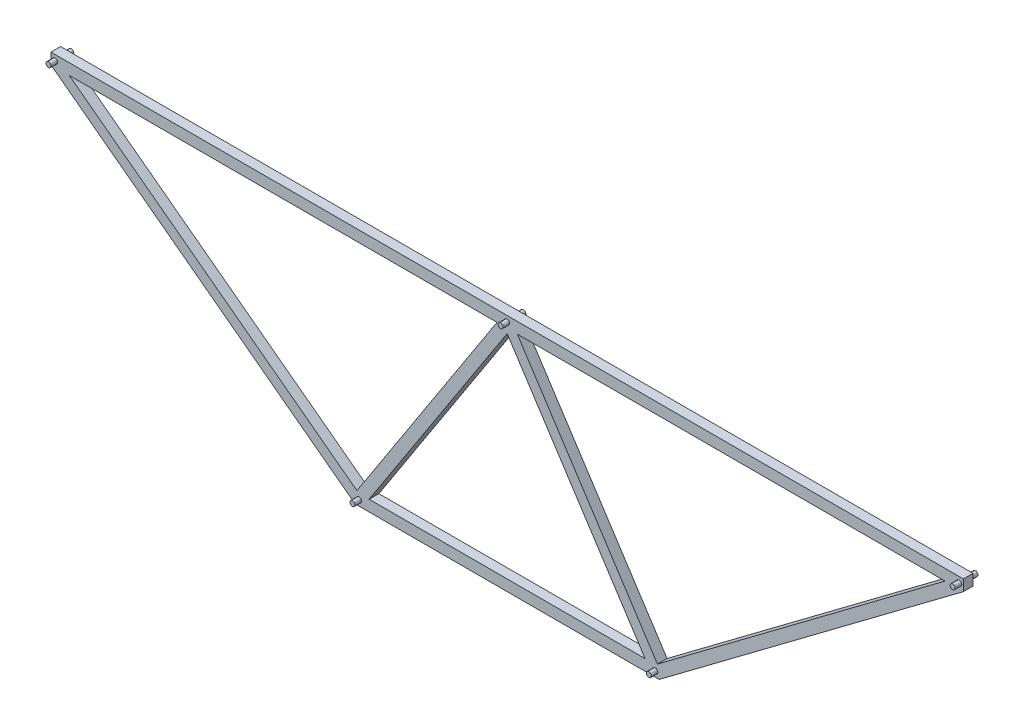
ISO-10303-21;
HEADER;
FILE_DESCRIPTION(('STEP AP214'),'2;1');
FILE_NAME('part.step','',(''),(''),'','','');
FILE_SCHEMA(('AUTOMOTIVE_DESIGN { 1 0 10303 214 1 1 1 1 }'));
ENDSEC;
DATA;
#1=APPLICATION_CONTEXT('core data for automotive mechanical design processes');
#2=APPLICATION_PROTOCOL_DEFINITION('international standard','automotive_design',2000,#1);
#3=PRODUCT_CONTEXT('',#1,'mechanical');
#4=PRODUCT('Part','Part','',(#3));
#5=PRODUCT_RELATED_PRODUCT_CATEGORY('part','',(#4));
#6=PRODUCT_DEFINITION_FORMATION('','',#4);
#7=PRODUCT_DEFINITION_CONTEXT('part definition',#1,'design');
#8=PRODUCT_DEFINITION('design','',#6,#7);
#9=PRODUCT_DEFINITION_SHAPE('','',#8);
#10=(LENGTH_UNIT() NAMED_UNIT(*) SI_UNIT(.MILLI.,.METRE.));
#11=(NAMED_UNIT(*) PLANE_ANGLE_UNIT() SI_UNIT($,.RADIAN.));
#12=(NAMED_UNIT(*) SI_UNIT($,.STERADIAN.) SOLID_ANGLE_UNIT());
#13=UNCERTAINTY_MEASURE_WITH_UNIT(LENGTH_MEASURE(1.E-05),#10,'distance_accuracy_value','');
#14=(GEOMETRIC_REPRESENTATION_CONTEXT(3) GLOBAL_UNCERTAINTY_ASSIGNED_CONTEXT((#13)) GLOBAL_UNIT_ASSIGNED_CONTEXT((#10,
#11,#12)) REPRESENTATION_CONTEXT('',''));
#15=CARTESIAN_POINT('',(0.,0.,0.));
#16=DIRECTION('',(0.,0.,1.));
#17=DIRECTION('',(1.,0.,0.));
#18=AXIS2_PLACEMENT_3D('',#15,#16,#17);
#19=CARTESIAN_POINT('',(0.,-14.4899999999999,6.375));
#20=DIRECTION('',(0.,-1.,0.));
#21=DIRECTION('',(1.,0.,0.));
#22=AXIS2_PLACEMENT_3D('',#19,#20,#21);
#23=PLANE('',#22);
#24=DIRECTION('',(-1.,0.,0.));
#25=VECTOR('',#24,1.);
#26=CARTESIAN_POINT('',(0.,-14.4899999999999,-6.375));
#27=LINE('',#26,#25);
#28=CARTESIAN_POINT('',(-13.3443939456725,-14.4899999999999,-6.375));
#29=VERTEX_POINT('',#28);
#30=CARTESIAN_POINT('',(-575.85,-14.4899999999999,-6.375));
#31=VERTEX_POINT('',#30);
#32=EDGE_CURVE('E170',#29,#31,#27,.T.);
#33=ORIENTED_EDGE('',*,*,#32,.F.);
#34=DIRECTION('',(0.,0.,-1.));
#35=VECTOR('',#34,1.);
#36=CARTESIAN_POINT('',(-13.3443939456725,-14.4899999999999,6.375));
#37=LINE('',#36,#35);
#38=CARTESIAN_POINT('',(-13.3443939456725,-14.4899999999999,6.375));
#39=VERTEX_POINT('',#38);
#40=EDGE_CURVE('E163',#39,#29,#37,.T.);
#41=ORIENTED_EDGE('',*,*,#40,.F.);
#42=DIRECTION('',(-1.,0.,0.));
#43=VECTOR('',#42,1.);
#44=CARTESIAN_POINT('',(0.,-14.4899999999999,6.375));
#45=LINE('',#44,#43);
#46=CARTESIAN_POINT('',(-575.85,-14.4899999999999,6.375));
#47=VERTEX_POINT('',#46);
#48=EDGE_CURVE('E167',#39,#47,#45,.T.);
#49=ORIENTED_EDGE('',*,*,#48,.T.);
#50=DIRECTION('',(0.,0.,-1.));
#51=VECTOR('',#50,1.);
#52=CARTESIAN_POINT('',(-575.85,-14.4899999999999,6.375));
#53=LINE('',#52,#51);
#54=EDGE_CURVE('E124',#47,#31,#53,.T.);
#55=ORIENTED_EDGE('',*,*,#54,.T.);
#56=EDGE_LOOP('',(#33,#41,#49,#55));
#57=FACE_BOUND('',#56,.T.);
#58=ADVANCED_FACE('F50',(#57),#23,.T.);
#59=CARTESIAN_POINT('',(-2.76651894132001,1.79678724359608,6.375));
#60=DIRECTION('',(0.838644419486702,-0.544679297994528,0.));
#61=DIRECTION('',(0.544679297994528,0.838644419486703,0.));
#62=AXIS2_PLACEMENT_3D('',#59,#60,#61);
#63=PLANE('',#62);
#64=DIRECTION('',(-0.544679297994528,-0.838644419486703,0.));
#65=VECTOR('',#64,1.);
#66=CARTESIAN_POINT('',(-2.76651894132001,1.79678724359608,-6.375));
#67=LINE('',#66,#65);
#68=CARTESIAN_POINT('',(-197.595006689379,-298.181244982965,-6.375));
#69=VERTEX_POINT('',#68);
#70=EDGE_CURVE('E244',#29,#69,#67,.T.);
#71=ORIENTED_EDGE('',*,*,#70,.T.);
#72=DIRECTION('',(0.,0.,-1.));
#73=VECTOR('',#72,1.);
#74=CARTESIAN_POINT('',(-197.595006689379,-298.181244982965,6.375));
#75=LINE('',#74,#73);
#76=CARTESIAN_POINT('',(-197.595006689379,-298.181244982965,6.375));
#77=VERTEX_POINT('',#76);
#78=EDGE_CURVE('E171',#77,#69,#75,.T.);
#79=ORIENTED_EDGE('',*,*,#78,.F.);
#80=DIRECTION('',(-0.544679297994528,-0.838644419486703,0.));
#81=VECTOR('',#80,1.);
#82=CARTESIAN_POINT('',(-2.76651894132001,1.79678724359608,6.375));
#83=LINE('',#82,#81);
#84=EDGE_CURVE('E172',#39,#77,#83,.T.);
#85=ORIENTED_EDGE('',*,*,#84,.F.);
#86=ORIENTED_EDGE('',*,*,#40,.T.);
#87=EDGE_LOOP('',(#71,#79,#85,#86));
#88=FACE_BOUND('',#87,.T.);
#89=ADVANCED_FACE('F177',(#88),#63,.F.);
#90=CARTESIAN_POINT('',(-9.38543869704231,-6.09561578434463,6.375));
#91=DIRECTION('',(0.838644419486703,0.544679297994528,0.));
#92=DIRECTION('',(-0.544679297994528,0.838644419486703,0.));
#93=AXIS2_PLACEMENT_3D('',#90,#91,#92);
#94=PLANE('',#93);
#95=DIRECTION('',(0.544679297994528,-0.838644419486703,0.));
#96=VECTOR('',#95,1.);
#97=CARTESIAN_POINT('',(-9.38543869704231,-6.09561578434463,-6.375));
#98=LINE('',#97,#96);
#99=CARTESIAN_POINT('',(0.,-20.546405114304,-6.375));
#100=VERTEX_POINT('',#99);
#101=CARTESIAN_POINT('',(181.498361340734,-300.,-6.375));
#102=VERTEX_POINT('',#101);
#103=EDGE_CURVE('E226',#100,#102,#98,.T.);
#104=ORIENTED_EDGE('',*,*,#103,.T.);
#105=DIRECTION('',(0.,0.,-1.));
#106=VECTOR('',#105,1.);
#107=CARTESIAN_POINT('',(181.498361340734,-300.,6.375));
#108=LINE('',#107,#106);
#109=CARTESIAN_POINT('',(181.498361340734,-300.,6.375));
#110=VERTEX_POINT('',#109);
#111=EDGE_CURVE('E246',#110,#102,#108,.T.);
#112=ORIENTED_EDGE('',*,*,#111,.F.);
#113=DIRECTION('',(0.544679297994528,-0.838644419486703,0.));
#114=VECTOR('',#113,1.);
#115=CARTESIAN_POINT('',(-9.38543869704231,-6.09561578434463,6.375));
#116=LINE('',#115,#114);
#117=CARTESIAN_POINT('',(0.,-20.546405114304,6.375));
#118=VERTEX_POINT('',#117);
#119=EDGE_CURVE('E331',#118,#110,#116,.T.);
#120=ORIENTED_EDGE('',*,*,#119,.F.);
#121=DIRECTION('',(0.,0.,-1.));
#122=VECTOR('',#121,1.);
#123=CARTESIAN_POINT('',(0.,-20.546405114304,6.375));
#124=LINE('',#123,#122);
#125=EDGE_CURVE('E252',#118,#100,#124,.T.);
#126=ORIENTED_EDGE('',*,*,#125,.T.);
#127=EDGE_LOOP('',(#104,#112,#120,#126));
#128=FACE_BOUND('',#127,.T.);
#129=ADVANCED_FACE('F334',(#128),#94,.F.);
#130=CARTESIAN_POINT('',(0.,-300.,6.375));
#131=DIRECTION('',(0.,1.,0.));
#132=DIRECTION('',(-1.,0.,0.));
#133=AXIS2_PLACEMENT_3D('',#130,#131,#132);
#134=PLANE('',#133);
#135=DIRECTION('',(1.,0.,0.));
#136=VECTOR('',#135,1.);
#137=CARTESIAN_POINT('',(0.,-300.,-6.375));
#138=LINE('',#137,#136);
#139=CARTESIAN_POINT('',(-181.498361340734,-300.,-6.375));
#140=VERTEX_POINT('',#139);
#141=EDGE_CURVE('E232',#140,#102,#138,.T.);
#142=ORIENTED_EDGE('',*,*,#141,.F.);
#143=DIRECTION('',(0.,0.,-1.));
#144=VECTOR('',#143,1.);
#145=CARTESIAN_POINT('',(-181.498361340734,-300.,6.375));
#146=LINE('',#145,#144);
#147=CARTESIAN_POINT('',(-181.498361340734,-300.,6.375));
#148=VERTEX_POINT('',#147);
#149=EDGE_CURVE('E254',#148,#140,#146,.T.);
#150=ORIENTED_EDGE('',*,*,#149,.F.);
#151=DIRECTION('',(1.,0.,0.));
#152=VECTOR('',#151,1.);
#153=CARTESIAN_POINT('',(0.,-300.,6.375));
#154=LINE('',#153,#152);
#155=EDGE_CURVE('E183',#148,#110,#154,.T.);
#156=ORIENTED_EDGE('',*,*,#155,.T.);
#157=ORIENTED_EDGE('',*,*,#111,.T.);
#158=EDGE_LOOP('',(#142,#150,#156,#157));
#159=FACE_BOUND('',#158,.T.);
#160=ADVANCED_FACE('F335',(#159),#134,.T.);
#161=CARTESIAN_POINT('',(222.9552,-297.2736,6.375));
#162=DIRECTION('',(-0.6,0.8,0.));
#163=DIRECTION('',(-0.8,-0.6,0.));
#164=AXIS2_PLACEMENT_3D('',#161,#162,#163);
#165=PLANE('',#164);
#166=DIRECTION('',(0.8,0.6,0.));
#167=VECTOR('',#166,1.);
#168=CARTESIAN_POINT('',(222.9552,-297.2736,-6.375));
#169=LINE('',#168,#167);
#170=CARTESIAN_POINT('',(200.,-314.49,-6.375));
#171=VERTEX_POINT('',#170);
#172=CARTESIAN_POINT('',(600.,-14.49,-6.375));
#173=VERTEX_POINT('',#172);
#174=EDGE_CURVE('E202',#171,#173,#169,.T.);
#175=ORIENTED_EDGE('',*,*,#174,.T.);
#176=DIRECTION('',(0.,0.,-1.));
#177=VECTOR('',#176,1.);
#178=CARTESIAN_POINT('',(600.,-14.49,6.375));
#179=LINE('',#178,#177);
#180=CARTESIAN_POINT('',(600.,-14.49,6.375));
#181=VERTEX_POINT('',#180);
#182=EDGE_CURVE('E258',#181,#173,#179,.T.);
#183=ORIENTED_EDGE('',*,*,#182,.F.);
#184=DIRECTION('',(0.8,0.6,0.));
#185=VECTOR('',#184,1.);
#186=CARTESIAN_POINT('',(222.9552,-297.2736,6.375));
#187=LINE('',#186,#185);
#188=CARTESIAN_POINT('',(200.,-314.49,6.375));
#189=VERTEX_POINT('',#188);
#190=EDGE_CURVE('E359',#189,#181,#187,.T.);
#191=ORIENTED_EDGE('',*,*,#190,.F.);
#192=DIRECTION('',(0.,0.,-1.));
#193=VECTOR('',#192,1.);
#194=CARTESIAN_POINT('',(200.,-314.49,6.375));
#195=LINE('',#194,#193);
#196=EDGE_CURVE('E261',#189,#171,#195,.T.);
#197=ORIENTED_EDGE('',*,*,#196,.T.);
#198=EDGE_LOOP('',(#175,#183,#191,#197));
#199=FACE_BOUND('',#198,.T.);
#200=ADVANCED_FACE('F469',(#199),#165,.F.);
#201=CARTESIAN_POINT('',(600.,0.,6.375));
#202=DIRECTION('',(1.,0.,0.));
#203=DIRECTION('',(0.,0.,-1.));
#204=AXIS2_PLACEMENT_3D('',#201,#202,#203);
#205=PLANE('',#204);
#206=DIRECTION('',(0.,-1.,0.));
#207=VECTOR('',#206,1.);
#208=CARTESIAN_POINT('',(600.,0.,-6.375));
#209=LINE('',#208,#207);
#210=CARTESIAN_POINT('',(600.,3.66859327116945E-13,-6.375));
#211=VERTEX_POINT('',#210);
#212=EDGE_CURVE('E207',#211,#173,#209,.T.);
#213=ORIENTED_EDGE('',*,*,#212,.F.);
#214=DIRECTION('',(0.,0.,-1.));
#215=VECTOR('',#214,1.);
#216=CARTESIAN_POINT('',(600.,3.66859327116945E-13,6.375));
#217=LINE('',#216,#215);
#218=CARTESIAN_POINT('',(600.,3.66859327116945E-13,6.375));
#219=VERTEX_POINT('',#218);
#220=EDGE_CURVE('E274',#219,#211,#217,.T.);
#221=ORIENTED_EDGE('',*,*,#220,.F.);
#222=DIRECTION('',(0.,-1.,0.));
#223=VECTOR('',#222,1.);
#224=CARTESIAN_POINT('',(600.,0.,6.375));
#225=LINE('',#224,#223);
#226=EDGE_CURVE('E355',#219,#181,#225,.T.);
#227=ORIENTED_EDGE('',*,*,#226,.T.);
#228=ORIENTED_EDGE('',*,*,#182,.T.);
#229=EDGE_LOOP('',(#213,#221,#227,#228));
#230=FACE_BOUND('',#229,.T.);
#231=ADVANCED_FACE('F484',(#230),#205,.T.);
#232=CARTESIAN_POINT('',(0.,3.66859327116945E-13,6.375));
#233=DIRECTION('',(0.,-1.,0.));
#234=DIRECTION('',(0.,0.,-1.));
#235=AXIS2_PLACEMENT_3D('',#232,#233,#234);
#236=PLANE('',#235);
#237=DIRECTION('',(-1.,0.,0.));
#238=VECTOR('',#237,1.);
#239=CARTESIAN_POINT('',(0.,3.66859327116945E-13,-6.375));
#240=LINE('',#239,#238);
#241=CARTESIAN_POINT('',(-600.,3.66859327116945E-13,-6.375));
#242=VERTEX_POINT('',#241);
#243=EDGE_CURVE('E213',#211,#242,#240,.T.);
#244=ORIENTED_EDGE('',*,*,#243,.T.);
#245=DIRECTION('',(0.,0.,-1.));
#246=VECTOR('',#245,1.);
#247=CARTESIAN_POINT('',(-600.,3.66859327116945E-13,6.375));
#248=LINE('',#247,#246);
#249=CARTESIAN_POINT('',(-600.,3.66859327116945E-13,6.375));
#250=VERTEX_POINT('',#249);
#251=EDGE_CURVE('E271',#250,#242,#248,.T.);
#252=ORIENTED_EDGE('',*,*,#251,.F.);
#253=DIRECTION('',(-1.,0.,0.));
#254=VECTOR('',#253,1.);
#255=CARTESIAN_POINT('',(0.,3.66859327116945E-13,6.375));
#256=LINE('',#255,#254);
#257=EDGE_CURVE('E348',#219,#250,#256,.T.);
#258=ORIENTED_EDGE('',*,*,#257,.F.);
#259=ORIENTED_EDGE('',*,*,#220,.T.);
#260=EDGE_LOOP('',(#244,#252,#258,#259));
#261=FACE_BOUND('',#260,.T.);
#262=ADVANCED_FACE('F481',(#261),#236,.F.);
#263=CARTESIAN_POINT('',(-600.,0.,6.375));
#264=DIRECTION('',(1.,0.,0.));
#265=DIRECTION('',(0.,0.,-1.));
#266=AXIS2_PLACEMENT_3D('',#263,#264,#265);
#267=PLANE('',#266);
#268=DIRECTION('',(0.,-1.,0.));
#269=VECTOR('',#268,1.);
#270=CARTESIAN_POINT('',(-600.,0.,-6.375));
#271=LINE('',#270,#269);
#272=CARTESIAN_POINT('',(-600.,-14.4899999999999,-6.375));
#273=VERTEX_POINT('',#272);
#274=EDGE_CURVE('E216',#242,#273,#271,.T.);
#275=ORIENTED_EDGE('',*,*,#274,.T.);
#276=DIRECTION('',(0.,0.,-1.));
#277=VECTOR('',#276,1.);
#278=CARTESIAN_POINT('',(-600.,-14.4899999999999,6.375));
#279=LINE('',#278,#277);
#280=CARTESIAN_POINT('',(-600.,-14.4899999999999,6.375));
#281=VERTEX_POINT('',#280);
#282=EDGE_CURVE('E268',#281,#273,#279,.T.);
#283=ORIENTED_EDGE('',*,*,#282,.F.);
#284=DIRECTION('',(0.,-1.,0.));
#285=VECTOR('',#284,1.);
#286=CARTESIAN_POINT('',(-600.,0.,6.375));
#287=LINE('',#286,#285);
#288=EDGE_CURVE('E350',#250,#281,#287,.T.);
#289=ORIENTED_EDGE('',*,*,#288,.F.);
#290=ORIENTED_EDGE('',*,*,#251,.T.);
#291=EDGE_LOOP('',(#275,#283,#289,#290));
#292=FACE_BOUND('',#291,.T.);
#293=ADVANCED_FACE('F480',(#292),#267,.F.);
#294=CARTESIAN_POINT('',(-222.9552,-297.2736,6.375));
#295=DIRECTION('',(-0.6,-0.8,0.));
#296=DIRECTION('',(0.8,-0.6,0.));
#297=AXIS2_PLACEMENT_3D('',#294,#295,#296);
#298=PLANE('',#297);
#299=DIRECTION('',(-0.8,0.6,0.));
#300=VECTOR('',#299,1.);
#301=CARTESIAN_POINT('',(-222.9552,-297.2736,-6.375));
#302=LINE('',#301,#300);
#303=CARTESIAN_POINT('',(-200.,-314.49,-6.375));
#304=VERTEX_POINT('',#303);
#305=EDGE_CURVE('E219',#304,#273,#302,.T.);
#306=ORIENTED_EDGE('',*,*,#305,.F.);
#307=DIRECTION('',(0.,0.,-1.));
#308=VECTOR('',#307,1.);
#309=CARTESIAN_POINT('',(-200.,-314.49,6.375));
#310=LINE('',#309,#308);
#311=CARTESIAN_POINT('',(-200.,-314.49,6.375));
#312=VERTEX_POINT('',#311);
#313=EDGE_CURVE('E264',#312,#304,#310,.T.);
#314=ORIENTED_EDGE('',*,*,#313,.F.);
#315=DIRECTION('',(-0.8,0.6,0.));
#316=VECTOR('',#315,1.);
#317=CARTESIAN_POINT('',(-222.9552,-297.2736,6.375));
#318=LINE('',#317,#316);
#319=EDGE_CURVE('E345',#312,#281,#318,.T.);
#320=ORIENTED_EDGE('',*,*,#319,.T.);
#321=ORIENTED_EDGE('',*,*,#282,.T.);
#322=EDGE_LOOP('',(#306,#314,#320,#321));
#323=FACE_BOUND('',#322,.T.);
#324=ADVANCED_FACE('F475',(#323),#298,.T.);
#325=CARTESIAN_POINT('',(0.,-14.4899999999999,6.375));
#326=DIRECTION('',(0.,-1.,0.));
#327=DIRECTION('',(1.,0.,0.));
#328=AXIS2_PLACEMENT_3D('',#325,#326,#327);
#329=PLANE('',#328);
#330=DIRECTION('',(-1.,0.,0.));
#331=VECTOR('',#330,1.);
#332=CARTESIAN_POINT('',(0.,-14.4899999999999,-6.375));
#333=LINE('',#332,#331);
#334=CARTESIAN_POINT('',(575.85,-14.49,-6.375));
#335=VERTEX_POINT('',#334);
#336=CARTESIAN_POINT('',(13.3443939456725,-14.4899999999999,-6.375));
#337=VERTEX_POINT('',#336);
#338=EDGE_CURVE('E194',#335,#337,#333,.T.);
#339=ORIENTED_EDGE('',*,*,#338,.F.);
#340=DIRECTION('',(0.,0.,-1.));
#341=VECTOR('',#340,1.);
#342=CARTESIAN_POINT('',(575.85,-14.49,6.375));
#343=LINE('',#342,#341);
#344=CARTESIAN_POINT('',(575.85,-14.49,6.375));
#345=VERTEX_POINT('',#344);
#346=EDGE_CURVE('E129',#345,#335,#343,.T.);
#347=ORIENTED_EDGE('',*,*,#346,.F.);
#348=DIRECTION('',(-1.,0.,0.));
#349=VECTOR('',#348,1.);
#350=CARTESIAN_POINT('',(0.,-14.4899999999999,6.375));
#351=LINE('',#350,#349);
#352=CARTESIAN_POINT('',(13.3443939456725,-14.4899999999999,6.375));
#353=VERTEX_POINT('',#352);
#354=EDGE_CURVE('E247',#345,#353,#351,.T.);
#355=ORIENTED_EDGE('',*,*,#354,.T.);
#356=DIRECTION('',(0.,0.,-1.));
#357=VECTOR('',#356,1.);
#358=CARTESIAN_POINT('',(13.3443939456725,-14.4899999999999,6.375));
#359=LINE('',#358,#357);
#360=EDGE_CURVE('E192',#353,#337,#359,.T.);
#361=ORIENTED_EDGE('',*,*,#360,.T.);
#362=EDGE_LOOP('',(#339,#347,#355,#361));
#363=FACE_BOUND('',#362,.T.);
#364=ADVANCED_FACE('F47',(#363),#329,.T.);
#365=CARTESIAN_POINT('',(214.2612,-285.6816,6.375));
#366=DIRECTION('',(-0.6,0.8,0.));
#367=DIRECTION('',(-0.8,-0.6,0.));
#368=AXIS2_PLACEMENT_3D('',#365,#366,#367);
#369=PLANE('',#368);
#370=DIRECTION('',(0.8,0.6,0.));
#371=VECTOR('',#370,1.);
#372=CARTESIAN_POINT('',(214.2612,-285.6816,-6.375));
#373=LINE('',#372,#371);
#374=CARTESIAN_POINT('',(197.59500668938,-298.181244982965,-6.375));
#375=VERTEX_POINT('',#374);
#376=EDGE_CURVE('E198',#375,#335,#373,.T.);
#377=ORIENTED_EDGE('',*,*,#376,.F.);
#378=DIRECTION('',(0.,0.,-1.));
#379=VECTOR('',#378,1.);
#380=CARTESIAN_POINT('',(197.59500668938,-298.181244982965,6.375));
#381=LINE('',#380,#379);
#382=CARTESIAN_POINT('',(197.59500668938,-298.181244982965,6.375));
#383=VERTEX_POINT('',#382);
#384=EDGE_CURVE('E281',#383,#375,#381,.T.);
#385=ORIENTED_EDGE('',*,*,#384,.F.);
#386=DIRECTION('',(0.8,0.6,0.));
#387=VECTOR('',#386,1.);
#388=CARTESIAN_POINT('',(214.2612,-285.6816,6.375));
#389=LINE('',#388,#387);
#390=EDGE_CURVE('E365',#383,#345,#389,.T.);
#391=ORIENTED_EDGE('',*,*,#390,.T.);
#392=ORIENTED_EDGE('',*,*,#346,.T.);
#393=EDGE_LOOP('',(#377,#385,#391,#392));
#394=FACE_BOUND('',#393,.T.);
#395=ADVANCED_FACE('F463',(#394),#369,.T.);
#396=CARTESIAN_POINT('',(9.38543869704231,-6.09561578434462,6.375));
#397=DIRECTION('',(0.838644419486703,-0.544679297994527,0.));
#398=DIRECTION('',(0.544679297994527,0.838644419486703,0.));
#399=AXIS2_PLACEMENT_3D('',#396,#397,#398);
#400=PLANE('',#399);
#401=DIRECTION('',(-0.544679297994527,-0.838644419486703,0.));
#402=VECTOR('',#401,1.);
#403=CARTESIAN_POINT('',(9.38543869704231,-6.09561578434462,-6.375));
#404=LINE('',#403,#402);
#405=EDGE_CURVE('E233',#100,#140,#404,.T.);
#406=ORIENTED_EDGE('',*,*,#405,.F.);
#407=ORIENTED_EDGE('',*,*,#125,.F.);
#408=DIRECTION('',(-0.544679297994527,-0.838644419486703,0.));
#409=VECTOR('',#408,1.);
#410=CARTESIAN_POINT('',(9.38543869704231,-6.09561578434462,6.375));
#411=LINE('',#410,#409);
#412=EDGE_CURVE('E182',#118,#148,#411,.T.);
#413=ORIENTED_EDGE('',*,*,#412,.T.);
#414=ORIENTED_EDGE('',*,*,#149,.T.);
#415=EDGE_LOOP('',(#406,#407,#413,#414));
#416=FACE_BOUND('',#415,.T.);
#417=ADVANCED_FACE('F326',(#416),#400,.T.);
#418=CARTESIAN_POINT('',(0.,-314.49,6.375));
#419=DIRECTION('',(0.,1.,0.));
#420=DIRECTION('',(-1.,0.,0.));
#421=AXIS2_PLACEMENT_3D('',#418,#419,#420);
#422=PLANE('',#421);
#423=DIRECTION('',(1.,0.,0.));
#424=VECTOR('',#423,1.);
#425=CARTESIAN_POINT('',(0.,-314.49,-6.375));
#426=LINE('',#425,#424);
#427=EDGE_CURVE('E221',#304,#171,#426,.T.);
#428=ORIENTED_EDGE('',*,*,#427,.T.);
#429=ORIENTED_EDGE('',*,*,#196,.F.);
#430=DIRECTION('',(1.,0.,0.));
#431=VECTOR('',#430,1.);
#432=CARTESIAN_POINT('',(0.,-314.49,6.375));
#433=LINE('',#432,#431);
#434=EDGE_CURVE('E336',#312,#189,#433,.T.);
#435=ORIENTED_EDGE('',*,*,#434,.F.);
#436=ORIENTED_EDGE('',*,*,#313,.T.);
#437=EDGE_LOOP('',(#428,#429,#435,#436));
#438=FACE_BOUND('',#437,.T.);
#439=ADVANCED_FACE('F465',(#438),#422,.F.);
#440=CARTESIAN_POINT('',(2.76651894132001,1.79678724359608,6.375));
#441=DIRECTION('',(0.838644419486702,0.544679297994528,0.));
#442=DIRECTION('',(-0.544679297994528,0.838644419486702,0.));
#443=AXIS2_PLACEMENT_3D('',#440,#441,#442);
#444=PLANE('',#443);
#445=DIRECTION('',(0.544679297994528,-0.838644419486702,0.));
#446=VECTOR('',#445,1.);
#447=CARTESIAN_POINT('',(2.76651894132001,1.79678724359608,-6.375));
#448=LINE('',#447,#446);
#449=EDGE_CURVE('E203',#337,#375,#448,.T.);
#450=ORIENTED_EDGE('',*,*,#449,.F.);
#451=ORIENTED_EDGE('',*,*,#360,.F.);
#452=DIRECTION('',(0.544679297994528,-0.838644419486702,0.));
#453=VECTOR('',#452,1.);
#454=CARTESIAN_POINT('',(2.76651894132001,1.79678724359608,6.375));
#455=LINE('',#454,#453);
#456=EDGE_CURVE('E358',#353,#383,#455,.T.);
#457=ORIENTED_EDGE('',*,*,#456,.T.);
#458=ORIENTED_EDGE('',*,*,#384,.T.);
#459=EDGE_LOOP('',(#450,#451,#457,#458));
#460=FACE_BOUND('',#459,.T.);
#461=ADVANCED_FACE('F472',(#460),#444,.T.);
#462=CARTESIAN_POINT('',(-214.2612,-285.6816,6.375));
#463=DIRECTION('',(-0.6,-0.8,0.));
#464=DIRECTION('',(0.8,-0.6,0.));
#465=AXIS2_PLACEMENT_3D('',#462,#463,#464);
#466=PLANE('',#465);
#467=DIRECTION('',(-0.8,0.6,0.));
#468=VECTOR('',#467,1.);
#469=CARTESIAN_POINT('',(-214.2612,-285.6816,-6.375));
#470=LINE('',#469,#468);
#471=EDGE_CURVE('E113',#69,#31,#470,.T.);
#472=ORIENTED_EDGE('',*,*,#471,.T.);
#473=ORIENTED_EDGE('',*,*,#54,.F.);
#474=DIRECTION('',(-0.8,0.6,0.));
#475=VECTOR('',#474,1.);
#476=CARTESIAN_POINT('',(-214.2612,-285.6816,6.375));
#477=LINE('',#476,#475);
#478=EDGE_CURVE('E62',#77,#47,#477,.T.);
#479=ORIENTED_EDGE('',*,*,#478,.F.);
#480=ORIENTED_EDGE('',*,*,#78,.T.);
#481=EDGE_LOOP('',(#472,#473,#479,#480));
#482=FACE_BOUND('',#481,.T.);
#483=ADVANCED_FACE('F493',(#482),#466,.F.);
#484=CARTESIAN_POINT('',(0.,0.,6.375));
#485=DIRECTION('',(0.,0.,1.));
#486=DIRECTION('',(1.,0.,0.));
#487=AXIS2_PLACEMENT_3D('',#484,#485,#486);
#488=PLANE('',#487);
#489=CARTESIAN_POINT('',(-594.56625,-7.24499999999989,6.375));
#490=DIRECTION('',(0.,0.,1.));
#491=DIRECTION('',(1.,0.,0.));
#492=AXIS2_PLACEMENT_3D('',#489,#490,#491);
#493=CIRCLE('',#492,3.29999999999998);
#494=CARTESIAN_POINT('',(-591.26625,-7.24499999999989,6.375));
#495=VERTEX_POINT('',#494);
#496=EDGE_CURVE('E197',#495,#495,#493,.F.);
#497=ORIENTED_EDGE('',*,*,#496,.T.);
#498=EDGE_LOOP('',(#497));
#499=FACE_BOUND('',#498,.T.);
#500=CARTESIAN_POINT('',(-194.842755286407,-307.245,6.375));
#501=DIRECTION('',(0.,0.,1.));
#502=DIRECTION('',(1.,0.,0.));
#503=AXIS2_PLACEMENT_3D('',#500,#501,#502);
#504=CIRCLE('',#503,3.30000000000001);
#505=CARTESIAN_POINT('',(-191.542755286407,-307.245,6.375));
#506=VERTEX_POINT('',#505);
#507=EDGE_CURVE('E373',#506,#506,#504,.F.);
#508=ORIENTED_EDGE('',*,*,#507,.T.);
#509=EDGE_LOOP('',(#508));
#510=FACE_BOUND('',#509,.T.);
#511=CARTESIAN_POINT('',(194.842755286407,-307.245,6.375));
#512=DIRECTION('',(0.,0.,1.));
#513=DIRECTION('',(1.,0.,0.));
#514=AXIS2_PLACEMENT_3D('',#511,#512,#513);
#515=CIRCLE('',#514,3.30000000000001);
#516=CARTESIAN_POINT('',(198.142755286407,-307.245,6.375));
#517=VERTEX_POINT('',#516);
#518=EDGE_CURVE('E380',#517,#517,#515,.F.);
#519=ORIENTED_EDGE('',*,*,#518,.T.);
#520=EDGE_LOOP('',(#519));
#521=FACE_BOUND('',#520,.T.);
#522=CARTESIAN_POINT('',(0.,-7.24499999999985,6.375));
#523=DIRECTION('',(0.,0.,1.));
#524=DIRECTION('',(1.,0.,0.));
#525=AXIS2_PLACEMENT_3D('',#522,#523,#524);
#526=CIRCLE('',#525,3.3);
#527=CARTESIAN_POINT('',(3.3,-7.24499999999985,6.375));
#528=VERTEX_POINT('',#527);
#529=EDGE_CURVE('E381',#528,#528,#526,.F.);
#530=ORIENTED_EDGE('',*,*,#529,.T.);
#531=EDGE_LOOP('',(#530));
#532=FACE_BOUND('',#531,.T.);
#533=CARTESIAN_POINT('',(594.56625,-7.24499999999978,6.375));
#534=DIRECTION('',(0.,0.,1.));
#535=DIRECTION('',(1.,0.,0.));
#536=AXIS2_PLACEMENT_3D('',#533,#534,#535);
#537=CIRCLE('',#536,3.29999999999998);
#538=CARTESIAN_POINT('',(597.86625,-7.24499999999978,6.375));
#539=VERTEX_POINT('',#538);
#540=EDGE_CURVE('E384',#539,#539,#537,.F.);
#541=ORIENTED_EDGE('',*,*,#540,.T.);
#542=EDGE_LOOP('',(#541));
#543=FACE_BOUND('',#542,.T.);
#544=ORIENTED_EDGE('',*,*,#354,.F.);
#545=ORIENTED_EDGE('',*,*,#390,.F.);
#546=ORIENTED_EDGE('',*,*,#456,.F.);
#547=EDGE_LOOP('',(#544,#545,#546));
#548=FACE_BOUND('',#547,.T.);
#549=ORIENTED_EDGE('',*,*,#190,.T.);
#550=ORIENTED_EDGE('',*,*,#226,.F.);
#551=ORIENTED_EDGE('',*,*,#257,.T.);
#552=ORIENTED_EDGE('',*,*,#288,.T.);
#553=ORIENTED_EDGE('',*,*,#319,.F.);
#554=ORIENTED_EDGE('',*,*,#434,.T.);
#555=EDGE_LOOP('',(#549,#550,#551,#552,#553,#554));
#556=FACE_BOUND('',#555,.T.);
#557=ORIENTED_EDGE('',*,*,#119,.T.);
#558=ORIENTED_EDGE('',*,*,#155,.F.);
#559=ORIENTED_EDGE('',*,*,#412,.F.);
#560=EDGE_LOOP('',(#557,#558,#559));
#561=FACE_BOUND('',#560,.T.);
#562=ORIENTED_EDGE('',*,*,#48,.F.);
#563=ORIENTED_EDGE('',*,*,#84,.T.);
#564=ORIENTED_EDGE('',*,*,#478,.T.);
#565=EDGE_LOOP('',(#562,#563,#564));
#566=FACE_BOUND('',#565,.T.);
#567=ADVANCED_FACE('F176',(#499,#510,#521,#532,#543,#548,#556,#561,#566),#488,.T.);
#568=CARTESIAN_POINT('',(0.,0.,-6.375));
#569=DIRECTION('',(0.,0.,1.));
#570=DIRECTION('',(1.,0.,0.));
#571=AXIS2_PLACEMENT_3D('',#568,#569,#570);
#572=PLANE('',#571);
#573=CARTESIAN_POINT('',(-594.56625,-7.24499999999989,-6.375));
#574=DIRECTION('',(0.,0.,1.));
#575=DIRECTION('',(1.,0.,0.));
#576=AXIS2_PLACEMENT_3D('',#573,#574,#575);
#577=CIRCLE('',#576,3.29999999999998);
#578=CARTESIAN_POINT('',(-591.26625,-7.24499999999989,-6.375));
#579=VERTEX_POINT('',#578);
#580=EDGE_CURVE('E11',#579,#579,#577,.F.);
#581=ORIENTED_EDGE('',*,*,#580,.F.);
#582=EDGE_LOOP('',(#581));
#583=FACE_BOUND('',#582,.T.);
#584=CARTESIAN_POINT('',(-194.842755286407,-307.245,-6.375));
#585=DIRECTION('',(0.,0.,1.));
#586=DIRECTION('',(1.,0.,0.));
#587=AXIS2_PLACEMENT_3D('',#584,#585,#586);
#588=CIRCLE('',#587,3.30000000000001);
#589=CARTESIAN_POINT('',(-191.542755286407,-307.245,-6.375));
#590=VERTEX_POINT('',#589);
#591=EDGE_CURVE('E60',#590,#590,#588,.F.);
#592=ORIENTED_EDGE('',*,*,#591,.F.);
#593=EDGE_LOOP('',(#592));
#594=FACE_BOUND('',#593,.T.);
#595=CARTESIAN_POINT('',(194.842755286407,-307.245,-6.375));
#596=DIRECTION('',(0.,0.,1.));
#597=DIRECTION('',(1.,0.,0.));
#598=AXIS2_PLACEMENT_3D('',#595,#596,#597);
#599=CIRCLE('',#598,3.30000000000001);
#600=CARTESIAN_POINT('',(198.142755286407,-307.245,-6.375));
#601=VERTEX_POINT('',#600);
#602=EDGE_CURVE('E294',#601,#601,#599,.F.);
#603=ORIENTED_EDGE('',*,*,#602,.F.);
#604=EDGE_LOOP('',(#603));
#605=FACE_BOUND('',#604,.T.);
#606=CARTESIAN_POINT('',(0.,-7.24499999999985,-6.375));
#607=DIRECTION('',(0.,0.,1.));
#608=DIRECTION('',(1.,0.,0.));
#609=AXIS2_PLACEMENT_3D('',#606,#607,#608);
#610=CIRCLE('',#609,3.3);
#611=CARTESIAN_POINT('',(3.3,-7.24499999999985,-6.375));
#612=VERTEX_POINT('',#611);
#613=EDGE_CURVE('E288',#612,#612,#610,.F.);
#614=ORIENTED_EDGE('',*,*,#613,.F.);
#615=EDGE_LOOP('',(#614));
#616=FACE_BOUND('',#615,.T.);
#617=CARTESIAN_POINT('',(594.56625,-7.24499999999978,-6.375));
#618=DIRECTION('',(0.,0.,1.));
#619=DIRECTION('',(1.,0.,0.));
#620=AXIS2_PLACEMENT_3D('',#617,#618,#619);
#621=CIRCLE('',#620,3.29999999999998);
#622=CARTESIAN_POINT('',(597.86625,-7.24499999999978,-6.375));
#623=VERTEX_POINT('',#622);
#624=EDGE_CURVE('E174',#623,#623,#621,.F.);
#625=ORIENTED_EDGE('',*,*,#624,.F.);
#626=EDGE_LOOP('',(#625));
#627=FACE_BOUND('',#626,.T.);
#628=ORIENTED_EDGE('',*,*,#338,.T.);
#629=ORIENTED_EDGE('',*,*,#449,.T.);
#630=ORIENTED_EDGE('',*,*,#376,.T.);
#631=EDGE_LOOP('',(#628,#629,#630));
#632=FACE_BOUND('',#631,.T.);
#633=ORIENTED_EDGE('',*,*,#174,.F.);
#634=ORIENTED_EDGE('',*,*,#427,.F.);
#635=ORIENTED_EDGE('',*,*,#305,.T.);
#636=ORIENTED_EDGE('',*,*,#274,.F.);
#637=ORIENTED_EDGE('',*,*,#243,.F.);
#638=ORIENTED_EDGE('',*,*,#212,.T.);
#639=EDGE_LOOP('',(#633,#634,#635,#636,#637,#638));
#640=FACE_BOUND('',#639,.T.);
#641=ORIENTED_EDGE('',*,*,#103,.F.);
#642=ORIENTED_EDGE('',*,*,#405,.T.);
#643=ORIENTED_EDGE('',*,*,#141,.T.);
#644=EDGE_LOOP('',(#641,#642,#643));
#645=FACE_BOUND('',#644,.T.);
#646=ORIENTED_EDGE('',*,*,#32,.T.);
#647=ORIENTED_EDGE('',*,*,#471,.F.);
#648=ORIENTED_EDGE('',*,*,#70,.F.);
#649=EDGE_LOOP('',(#646,#647,#648));
#650=FACE_BOUND('',#649,.T.);
#651=ADVANCED_FACE('F305',(#583,#594,#605,#616,#627,#632,#640,#645,#650),#572,.F.);
#652=CARTESIAN_POINT('',(594.56625,-7.24499999999978,-14.975));
#653=DIRECTION('',(0.,0.,1.));
#654=DIRECTION('',(1.,0.,0.));
#655=AXIS2_PLACEMENT_3D('',#652,#653,#654);
#656=PLANE('',#655);
#657=CARTESIAN_POINT('',(594.56625,-7.24499999999978,-14.975));
#658=DIRECTION('',(0.,0.,1.));
#659=DIRECTION('',(1.,0.,0.));
#660=AXIS2_PLACEMENT_3D('',#657,#658,#659);
#661=CIRCLE('',#660,3.29999999999998);
#662=CARTESIAN_POINT('',(597.86625,-7.24499999999978,-14.975));
#663=VERTEX_POINT('',#662);
#664=EDGE_CURVE('E393',#663,#663,#661,.T.);
#665=ORIENTED_EDGE('',*,*,#664,.F.);
#666=EDGE_LOOP('',(#665));
#667=FACE_BOUND('',#666,.T.);
#668=ADVANCED_FACE('F308',(#667),#656,.F.);
#669=CARTESIAN_POINT('',(594.56625,-7.24499999999978,14.975));
#670=DIRECTION('',(0.,0.,-1.));
#671=DIRECTION('',(-1.,0.,0.));
#672=AXIS2_PLACEMENT_3D('',#669,#670,#671);
#673=CYLINDRICAL_SURFACE('',#672,3.29999999999998);
#674=ORIENTED_EDGE('',*,*,#664,.T.);
#675=EDGE_LOOP('',(#674));
#676=FACE_BOUND('',#675,.T.);
#677=ORIENTED_EDGE('',*,*,#624,.T.);
#678=EDGE_LOOP('',(#677));
#679=FACE_BOUND('',#678,.T.);
#680=ADVANCED_FACE('F536',(#676,#679),#673,.T.);
#681=CARTESIAN_POINT('',(0.,-7.24499999999985,-14.975));
#682=DIRECTION('',(0.,0.,1.));
#683=DIRECTION('',(1.,0.,0.));
#684=AXIS2_PLACEMENT_3D('',#681,#682,#683);
#685=PLANE('',#684);
#686=CARTESIAN_POINT('',(0.,-7.24499999999985,-14.975));
#687=DIRECTION('',(0.,0.,1.));
#688=DIRECTION('',(1.,0.,0.));
#689=AXIS2_PLACEMENT_3D('',#686,#687,#688);
#690=CIRCLE('',#689,3.3);
#691=CARTESIAN_POINT('',(3.3,-7.24499999999985,-14.975));
#692=VERTEX_POINT('',#691);
#693=EDGE_CURVE('E405',#692,#692,#690,.T.);
#694=ORIENTED_EDGE('',*,*,#693,.F.);
#695=EDGE_LOOP('',(#694));
#696=FACE_BOUND('',#695,.T.);
#697=ADVANCED_FACE('F546',(#696),#685,.F.);
#698=CARTESIAN_POINT('',(0.,-7.24499999999985,14.975));
#699=DIRECTION('',(0.,0.,-1.));
#700=DIRECTION('',(-1.,0.,0.));
#701=AXIS2_PLACEMENT_3D('',#698,#699,#700);
#702=CYLINDRICAL_SURFACE('',#701,3.3);
#703=ORIENTED_EDGE('',*,*,#693,.T.);
#704=EDGE_LOOP('',(#703));
#705=FACE_BOUND('',#704,.T.);
#706=ORIENTED_EDGE('',*,*,#613,.T.);
#707=EDGE_LOOP('',(#706));
#708=FACE_BOUND('',#707,.T.);
#709=ADVANCED_FACE('F548',(#705,#708),#702,.T.);
#710=CARTESIAN_POINT('',(194.842755286407,-307.245,-14.975));
#711=DIRECTION('',(0.,0.,1.));
#712=DIRECTION('',(1.,0.,0.));
#713=AXIS2_PLACEMENT_3D('',#710,#711,#712);
#714=PLANE('',#713);
#715=CARTESIAN_POINT('',(194.842755286407,-307.245,-14.975));
#716=DIRECTION('',(0.,0.,1.));
#717=DIRECTION('',(1.,0.,0.));
#718=AXIS2_PLACEMENT_3D('',#715,#716,#717);
#719=CIRCLE('',#718,3.30000000000001);
#720=CARTESIAN_POINT('',(198.142755286407,-307.245,-14.975));
#721=VERTEX_POINT('',#720);
#722=EDGE_CURVE('E407',#721,#721,#719,.T.);
#723=ORIENTED_EDGE('',*,*,#722,.F.);
#724=EDGE_LOOP('',(#723));
#725=FACE_BOUND('',#724,.T.);
#726=ADVANCED_FACE('F560',(#725),#714,.F.);
#727=CARTESIAN_POINT('',(194.842755286407,-307.245,14.975));
#728=DIRECTION('',(0.,0.,-1.));
#729=DIRECTION('',(-1.,0.,0.));
#730=AXIS2_PLACEMENT_3D('',#727,#728,#729);
#731=CYLINDRICAL_SURFACE('',#730,3.30000000000001);
#732=ORIENTED_EDGE('',*,*,#722,.T.);
#733=EDGE_LOOP('',(#732));
#734=FACE_BOUND('',#733,.T.);
#735=ORIENTED_EDGE('',*,*,#602,.T.);
#736=EDGE_LOOP('',(#735));
#737=FACE_BOUND('',#736,.T.);
#738=ADVANCED_FACE('F562',(#734,#737),#731,.T.);
#739=CARTESIAN_POINT('',(-194.842755286407,-307.245,-14.975));
#740=DIRECTION('',(0.,0.,1.));
#741=DIRECTION('',(1.,0.,0.));
#742=AXIS2_PLACEMENT_3D('',#739,#740,#741);
#743=PLANE('',#742);
#744=CARTESIAN_POINT('',(-194.842755286407,-307.245,-14.975));
#745=DIRECTION('',(0.,0.,1.));
#746=DIRECTION('',(1.,0.,0.));
#747=AXIS2_PLACEMENT_3D('',#744,#745,#746);
#748=CIRCLE('',#747,3.30000000000001);
#749=CARTESIAN_POINT('',(-191.542755286407,-307.245,-14.975));
#750=VERTEX_POINT('',#749);
#751=EDGE_CURVE('E416',#750,#750,#748,.T.);
#752=ORIENTED_EDGE('',*,*,#751,.F.);
#753=EDGE_LOOP('',(#752));
#754=FACE_BOUND('',#753,.T.);
#755=ADVANCED_FACE('F567',(#754),#743,.F.);
#756=CARTESIAN_POINT('',(-194.842755286407,-307.245,14.975));
#757=DIRECTION('',(0.,0.,-1.));
#758=DIRECTION('',(-1.,0.,0.));
#759=AXIS2_PLACEMENT_3D('',#756,#757,#758);
#760=CYLINDRICAL_SURFACE('',#759,3.30000000000001);
#761=ORIENTED_EDGE('',*,*,#751,.T.);
#762=EDGE_LOOP('',(#761));
#763=FACE_BOUND('',#762,.T.);
#764=ORIENTED_EDGE('',*,*,#591,.T.);
#765=EDGE_LOOP('',(#764));
#766=FACE_BOUND('',#765,.T.);
#767=ADVANCED_FACE('F302',(#763,#766),#760,.T.);
#768=CARTESIAN_POINT('',(-594.56625,-7.24499999999989,-14.975));
#769=DIRECTION('',(0.,0.,1.));
#770=DIRECTION('',(1.,0.,0.));
#771=AXIS2_PLACEMENT_3D('',#768,#769,#770);
#772=PLANE('',#771);
#773=CARTESIAN_POINT('',(-594.56625,-7.24499999999989,-14.975));
#774=DIRECTION('',(0.,0.,1.));
#775=DIRECTION('',(1.,0.,0.));
#776=AXIS2_PLACEMENT_3D('',#773,#774,#775);
#777=CIRCLE('',#776,3.29999999999998);
#778=CARTESIAN_POINT('',(-591.26625,-7.24499999999989,-14.975));
#779=VERTEX_POINT('',#778);
#780=EDGE_CURVE('E425',#779,#779,#777,.T.);
#781=ORIENTED_EDGE('',*,*,#780,.F.);
#782=EDGE_LOOP('',(#781));
#783=FACE_BOUND('',#782,.T.);
#784=ADVANCED_FACE('F452',(#783),#772,.F.);
#785=CARTESIAN_POINT('',(-594.56625,-7.24499999999989,14.975));
#786=DIRECTION('',(0.,0.,-1.));
#787=DIRECTION('',(-1.,0.,0.));
#788=AXIS2_PLACEMENT_3D('',#785,#786,#787);
#789=CYLINDRICAL_SURFACE('',#788,3.29999999999998);
#790=ORIENTED_EDGE('',*,*,#780,.T.);
#791=EDGE_LOOP('',(#790));
#792=FACE_BOUND('',#791,.T.);
#793=ORIENTED_EDGE('',*,*,#580,.T.);
#794=EDGE_LOOP('',(#793));
#795=FACE_BOUND('',#794,.T.);
#796=ADVANCED_FACE('F440',(#792,#795),#789,.T.);
#797=ORIENTED_EDGE('',*,*,#540,.F.);
#798=EDGE_LOOP('',(#797));
#799=FACE_BOUND('',#798,.T.);
#800=CARTESIAN_POINT('',(594.56625,-7.24499999999978,14.975));
#801=DIRECTION('',(0.,0.,1.));
#802=DIRECTION('',(1.,0.,0.));
#803=AXIS2_PLACEMENT_3D('',#800,#801,#802);
#804=CIRCLE('',#803,3.29999999999998);
#805=CARTESIAN_POINT('',(597.86625,-7.24499999999978,14.975));
#806=VERTEX_POINT('',#805);
#807=EDGE_CURVE('E388',#806,#806,#804,.T.);
#808=ORIENTED_EDGE('',*,*,#807,.F.);
#809=EDGE_LOOP('',(#808));
#810=FACE_BOUND('',#809,.T.);
#811=ADVANCED_FACE('F447',(#799,#810),#673,.T.);
#812=CARTESIAN_POINT('',(594.56625,-7.24499999999978,14.975));
#813=DIRECTION('',(0.,0.,1.));
#814=DIRECTION('',(1.,0.,0.));
#815=AXIS2_PLACEMENT_3D('',#812,#813,#814);
#816=PLANE('',#815);
#817=ORIENTED_EDGE('',*,*,#807,.T.);
#818=EDGE_LOOP('',(#817));
#819=FACE_BOUND('',#818,.T.);
#820=ADVANCED_FACE('F530',(#819),#816,.T.);
#821=ORIENTED_EDGE('',*,*,#529,.F.);
#822=EDGE_LOOP('',(#821));
#823=FACE_BOUND('',#822,.T.);
#824=CARTESIAN_POINT('',(0.,-7.24499999999985,14.975));
#825=DIRECTION('',(0.,0.,1.));
#826=DIRECTION('',(1.,0.,0.));
#827=AXIS2_PLACEMENT_3D('',#824,#825,#826);
#828=CIRCLE('',#827,3.3);
#829=CARTESIAN_POINT('',(3.3,-7.24499999999985,14.975));
#830=VERTEX_POINT('',#829);
#831=EDGE_CURVE('E400',#830,#830,#828,.T.);
#832=ORIENTED_EDGE('',*,*,#831,.F.);
#833=EDGE_LOOP('',(#832));
#834=FACE_BOUND('',#833,.T.);
#835=ADVANCED_FACE('F535',(#823,#834),#702,.T.);
#836=CARTESIAN_POINT('',(0.,-7.24499999999985,14.975));
#837=DIRECTION('',(0.,0.,1.));
#838=DIRECTION('',(1.,0.,0.));
#839=AXIS2_PLACEMENT_3D('',#836,#837,#838);
#840=PLANE('',#839);
#841=ORIENTED_EDGE('',*,*,#831,.T.);
#842=EDGE_LOOP('',(#841));
#843=FACE_BOUND('',#842,.T.);
#844=ADVANCED_FACE('F541',(#843),#840,.T.);
#845=ORIENTED_EDGE('',*,*,#518,.F.);
#846=EDGE_LOOP('',(#845));
#847=FACE_BOUND('',#846,.T.);
#848=CARTESIAN_POINT('',(194.842755286407,-307.245,14.975));
#849=DIRECTION('',(0.,0.,1.));
#850=DIRECTION('',(1.,0.,0.));
#851=AXIS2_PLACEMENT_3D('',#848,#849,#850);
#852=CIRCLE('',#851,3.30000000000001);
#853=CARTESIAN_POINT('',(198.142755286407,-307.245,14.975));
#854=VERTEX_POINT('',#853);
#855=EDGE_CURVE('E409',#854,#854,#852,.T.);
#856=ORIENTED_EDGE('',*,*,#855,.F.);
#857=EDGE_LOOP('',(#856));
#858=FACE_BOUND('',#857,.T.);
#859=ADVANCED_FACE('F542',(#847,#858),#731,.T.);
#860=CARTESIAN_POINT('',(194.842755286407,-307.245,14.975));
#861=DIRECTION('',(0.,0.,1.));
#862=DIRECTION('',(1.,0.,0.));
#863=AXIS2_PLACEMENT_3D('',#860,#861,#862);
#864=PLANE('',#863);
#865=ORIENTED_EDGE('',*,*,#855,.T.);
#866=EDGE_LOOP('',(#865));
#867=FACE_BOUND('',#866,.T.);
#868=ADVANCED_FACE('F551',(#867),#864,.T.);
#869=ORIENTED_EDGE('',*,*,#507,.F.);
#870=EDGE_LOOP('',(#869));
#871=FACE_BOUND('',#870,.T.);
#872=CARTESIAN_POINT('',(-194.842755286407,-307.245,14.975));
#873=DIRECTION('',(0.,0.,1.));
#874=DIRECTION('',(1.,0.,0.));
#875=AXIS2_PLACEMENT_3D('',#872,#873,#874);
#876=CIRCLE('',#875,3.30000000000001);
#877=CARTESIAN_POINT('',(-191.542755286407,-307.245,14.975));
#878=VERTEX_POINT('',#877);
#879=EDGE_CURVE('E411',#878,#878,#876,.T.);
#880=ORIENTED_EDGE('',*,*,#879,.F.);
#881=EDGE_LOOP('',(#880));
#882=FACE_BOUND('',#881,.T.);
#883=ADVANCED_FACE('F444',(#871,#882),#760,.T.);
#884=CARTESIAN_POINT('',(-194.842755286407,-307.245,14.975));
#885=DIRECTION('',(0.,0.,1.));
#886=DIRECTION('',(1.,0.,0.));
#887=AXIS2_PLACEMENT_3D('',#884,#885,#886);
#888=PLANE('',#887);
#889=ORIENTED_EDGE('',*,*,#879,.T.);
#890=EDGE_LOOP('',(#889));
#891=FACE_BOUND('',#890,.T.);
#892=ADVANCED_FACE('F432',(#891),#888,.T.);
#893=ORIENTED_EDGE('',*,*,#496,.F.);
#894=EDGE_LOOP('',(#893));
#895=FACE_BOUND('',#894,.T.);
#896=CARTESIAN_POINT('',(-594.56625,-7.24499999999989,14.975));
#897=DIRECTION('',(0.,0.,1.));
#898=DIRECTION('',(1.,0.,0.));
#899=AXIS2_PLACEMENT_3D('',#896,#897,#898);
#900=CIRCLE('',#899,3.29999999999998);
#901=CARTESIAN_POINT('',(-591.26625,-7.24499999999989,14.975));
#902=VERTEX_POINT('',#901);
#903=EDGE_CURVE('E386',#902,#902,#900,.T.);
#904=ORIENTED_EDGE('',*,*,#903,.F.);
#905=EDGE_LOOP('',(#904));
#906=FACE_BOUND('',#905,.T.);
#907=ADVANCED_FACE('F435',(#895,#906),#789,.T.);
#908=CARTESIAN_POINT('',(-594.56625,-7.24499999999989,14.975));
#909=DIRECTION('',(0.,0.,1.));
#910=DIRECTION('',(1.,0.,0.));
#911=AXIS2_PLACEMENT_3D('',#908,#909,#910);
#912=PLANE('',#911);
#913=ORIENTED_EDGE('',*,*,#903,.T.);
#914=EDGE_LOOP('',(#913));
#915=FACE_BOUND('',#914,.T.);
#916=ADVANCED_FACE('F429',(#915),#912,.T.);
#917=CLOSED_SHELL('',(#58,#89,#129,#160,#200,#231,#262,#293,#324,#364,#395,#417,#439,#461,#483,
#567,#651,#668,#680,#697,#709,#726,#738,#755,#767,#784,#796,#811,#820,#835,#844,#859,#868,#883,
#892,#907,#916));
#918=MANIFOLD_SOLID_BREP('B2',#917);
#919=ADVANCED_BREP_SHAPE_REPRESENTATION('',(#18,#918),#14);
#920=SHAPE_DEFINITION_REPRESENTATION(#9,#919);
ENDSEC;
END-ISO-10303-21;
